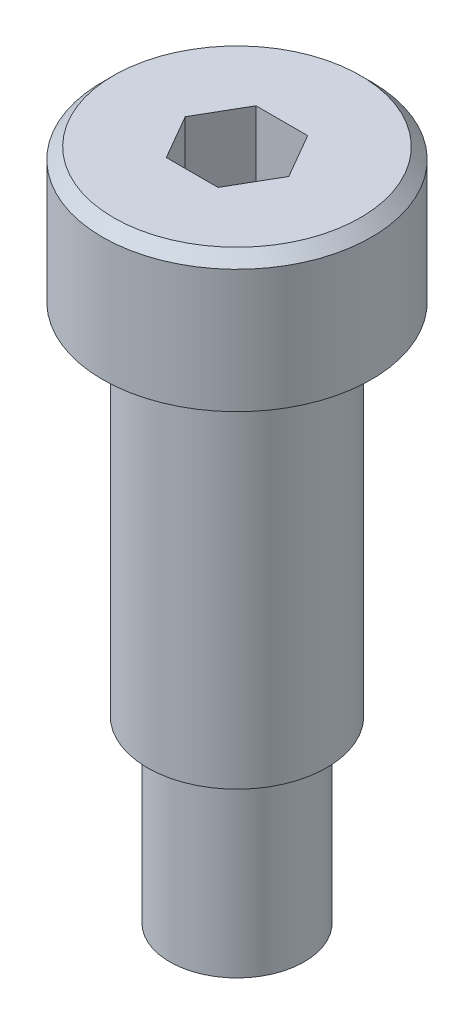
ISO-10303-21;
HEADER;
FILE_DESCRIPTION(('STEP AP214'),'2;1');
FILE_NAME('part.step','',(''),(''),'','','');
FILE_SCHEMA(('AUTOMOTIVE_DESIGN { 1 0 10303 214 1 1 1 1 }'));
ENDSEC;
DATA;
#1=APPLICATION_CONTEXT('core data for automotive mechanical design processes');
#2=APPLICATION_PROTOCOL_DEFINITION('international standard','automotive_design',2000,#1);
#3=PRODUCT_CONTEXT('',#1,'mechanical');
#4=PRODUCT('Part','Part','',(#3));
#5=PRODUCT_RELATED_PRODUCT_CATEGORY('part','',(#4));
#6=PRODUCT_DEFINITION_FORMATION('','',#4);
#7=PRODUCT_DEFINITION_CONTEXT('part definition',#1,'design');
#8=PRODUCT_DEFINITION('design','',#6,#7);
#9=PRODUCT_DEFINITION_SHAPE('','',#8);
#10=(LENGTH_UNIT() NAMED_UNIT(*) SI_UNIT(.MILLI.,.METRE.));
#11=(NAMED_UNIT(*) PLANE_ANGLE_UNIT() SI_UNIT($,.RADIAN.));
#12=(NAMED_UNIT(*) SI_UNIT($,.STERADIAN.) SOLID_ANGLE_UNIT());
#13=UNCERTAINTY_MEASURE_WITH_UNIT(LENGTH_MEASURE(1.E-05),#10,'distance_accuracy_value','');
#14=(GEOMETRIC_REPRESENTATION_CONTEXT(3) GLOBAL_UNCERTAINTY_ASSIGNED_CONTEXT((#13)) GLOBAL_UNIT_ASSIGNED_CONTEXT((#10,
#11,#12)) REPRESENTATION_CONTEXT('',''));
#15=CARTESIAN_POINT('',(0.,0.,0.));
#16=DIRECTION('',(0.,0.,1.));
#17=DIRECTION('',(1.,0.,0.));
#18=AXIS2_PLACEMENT_3D('',#15,#16,#17);
#19=CARTESIAN_POINT('',(0.,3.,0.));
#20=DIRECTION('',(0.,-1.,0.));
#21=DIRECTION('',(0.,0.,-1.));
#22=AXIS2_PLACEMENT_3D('',#19,#20,#21);
#23=CYLINDRICAL_SURFACE('',#22,3.);
#24=CARTESIAN_POINT('',(0.,2.75,0.));
#25=DIRECTION('',(0.,1.,0.));
#26=DIRECTION('',(0.,0.,1.));
#27=AXIS2_PLACEMENT_3D('',#24,#25,#26);
#28=CIRCLE('',#27,3.);
#29=CARTESIAN_POINT('',(0.,2.75,3.));
#30=VERTEX_POINT('',#29);
#31=EDGE_CURVE('E11',#30,#30,#28,.F.);
#32=ORIENTED_EDGE('',*,*,#31,.T.);
#33=EDGE_LOOP('',(#32));
#34=FACE_BOUND('',#33,.T.);
#35=CARTESIAN_POINT('',(0.,0.,0.));
#36=DIRECTION('',(0.,1.,0.));
#37=DIRECTION('',(0.,0.,1.));
#38=AXIS2_PLACEMENT_3D('',#35,#36,#37);
#39=CIRCLE('',#38,3.);
#40=CARTESIAN_POINT('',(0.,0.,3.));
#41=VERTEX_POINT('',#40);
#42=EDGE_CURVE('E153',#41,#41,#39,.T.);
#43=ORIENTED_EDGE('',*,*,#42,.T.);
#44=EDGE_LOOP('',(#43));
#45=FACE_BOUND('',#44,.T.);
#46=ADVANCED_FACE('F37',(#34,#45),#23,.T.);
#47=CARTESIAN_POINT('',(0.,3.,0.));
#48=DIRECTION('',(0.,1.,0.));
#49=DIRECTION('',(0.,0.,1.));
#50=AXIS2_PLACEMENT_3D('',#47,#48,#49);
#51=PLANE('',#50);
#52=CARTESIAN_POINT('',(0.,3.,0.));
#53=DIRECTION('',(0.,1.,0.));
#54=DIRECTION('',(0.,0.,1.));
#55=AXIS2_PLACEMENT_3D('',#52,#53,#54);
#56=CIRCLE('',#55,2.75);
#57=CARTESIAN_POINT('',(0.,3.,2.75));
#58=VERTEX_POINT('',#57);
#59=EDGE_CURVE('E45',#58,#58,#56,.T.);
#60=ORIENTED_EDGE('',*,*,#59,.T.);
#61=EDGE_LOOP('',(#60));
#62=FACE_BOUND('',#61,.T.);
#63=DIRECTION('',(-0.5,0.,-0.866025403784439));
#64=VECTOR('',#63,1.);
#65=CARTESIAN_POINT('',(1.15470053837925,3.,0.));
#66=LINE('',#65,#64);
#67=CARTESIAN_POINT('',(1.15470053837925,3.,0.));
#68=VERTEX_POINT('',#67);
#69=CARTESIAN_POINT('',(0.577350269189626,3.,-1.));
#70=VERTEX_POINT('',#69);
#71=EDGE_CURVE('E52',#68,#70,#66,.T.);
#72=ORIENTED_EDGE('',*,*,#71,.F.);
#73=DIRECTION('',(0.5,0.,-0.866025403784439));
#74=VECTOR('',#73,1.);
#75=CARTESIAN_POINT('',(0.577350269189626,3.,1.));
#76=LINE('',#75,#74);
#77=CARTESIAN_POINT('',(0.577350269189626,3.,1.));
#78=VERTEX_POINT('',#77);
#79=EDGE_CURVE('E135',#78,#68,#76,.T.);
#80=ORIENTED_EDGE('',*,*,#79,.F.);
#81=DIRECTION('',(1.,0.,0.));
#82=VECTOR('',#81,1.);
#83=CARTESIAN_POINT('',(-0.577350269189625,3.,1.));
#84=LINE('',#83,#82);
#85=CARTESIAN_POINT('',(-0.577350269189625,3.,1.));
#86=VERTEX_POINT('',#85);
#87=EDGE_CURVE('E133',#86,#78,#84,.T.);
#88=ORIENTED_EDGE('',*,*,#87,.F.);
#89=DIRECTION('',(0.5,0.,0.866025403784439));
#90=VECTOR('',#89,1.);
#91=CARTESIAN_POINT('',(-1.15470053837925,3.,0.));
#92=LINE('',#91,#90);
#93=CARTESIAN_POINT('',(-1.15470053837925,3.,0.));
#94=VERTEX_POINT('',#93);
#95=EDGE_CURVE('E100',#94,#86,#92,.T.);
#96=ORIENTED_EDGE('',*,*,#95,.F.);
#97=DIRECTION('',(-0.5,0.,0.866025403784439));
#98=VECTOR('',#97,1.);
#99=CARTESIAN_POINT('',(-0.577350269189626,3.,-1.));
#100=LINE('',#99,#98);
#101=CARTESIAN_POINT('',(-0.577350269189626,3.,-1.));
#102=VERTEX_POINT('',#101);
#103=EDGE_CURVE('E129',#102,#94,#100,.T.);
#104=ORIENTED_EDGE('',*,*,#103,.F.);
#105=DIRECTION('',(-1.,0.,0.));
#106=VECTOR('',#105,1.);
#107=CARTESIAN_POINT('',(0.577350269189626,3.,-1.));
#108=LINE('',#107,#106);
#109=EDGE_CURVE('E126',#70,#102,#108,.T.);
#110=ORIENTED_EDGE('',*,*,#109,.F.);
#111=EDGE_LOOP('',(#72,#80,#88,#96,#104,#110));
#112=FACE_BOUND('',#111,.T.);
#113=ADVANCED_FACE('F161',(#62,#112),#51,.T.);
#114=CARTESIAN_POINT('',(0.,0.,0.));
#115=DIRECTION('',(0.,1.,0.));
#116=DIRECTION('',(0.,0.,1.));
#117=AXIS2_PLACEMENT_3D('',#114,#115,#116);
#118=PLANE('',#117);
#119=CARTESIAN_POINT('',(0.,0.,0.));
#120=DIRECTION('',(0.,1.,0.));
#121=DIRECTION('',(0.,0.,1.));
#122=AXIS2_PLACEMENT_3D('',#119,#120,#121);
#123=CIRCLE('',#122,2.);
#124=CARTESIAN_POINT('',(0.,0.,2.));
#125=VERTEX_POINT('',#124);
#126=EDGE_CURVE('E156',#125,#125,#123,.F.);
#127=ORIENTED_EDGE('',*,*,#126,.F.);
#128=EDGE_LOOP('',(#127));
#129=FACE_BOUND('',#128,.T.);
#130=ORIENTED_EDGE('',*,*,#42,.F.);
#131=EDGE_LOOP('',(#130));
#132=FACE_BOUND('',#131,.T.);
#133=ADVANCED_FACE('F177',(#129,#132),#118,.F.);
#134=CARTESIAN_POINT('',(0.,-8.,0.));
#135=DIRECTION('',(0.,1.,0.));
#136=DIRECTION('',(0.,0.,1.));
#137=AXIS2_PLACEMENT_3D('',#134,#135,#136);
#138=CYLINDRICAL_SURFACE('',#137,2.);
#139=CARTESIAN_POINT('',(0.,-8.,0.));
#140=DIRECTION('',(0.,-1.,0.));
#141=DIRECTION('',(0.,0.,-1.));
#142=AXIS2_PLACEMENT_3D('',#139,#140,#141);
#143=CIRCLE('',#142,2.);
#144=CARTESIAN_POINT('',(0.,-8.,-2.));
#145=VERTEX_POINT('',#144);
#146=EDGE_CURVE('E148',#145,#145,#143,.T.);
#147=ORIENTED_EDGE('',*,*,#146,.F.);
#148=EDGE_LOOP('',(#147));
#149=FACE_BOUND('',#148,.T.);
#150=ORIENTED_EDGE('',*,*,#126,.T.);
#151=EDGE_LOOP('',(#150));
#152=FACE_BOUND('',#151,.T.);
#153=ADVANCED_FACE('F182',(#149,#152),#138,.T.);
#154=CARTESIAN_POINT('',(0.,-8.,0.));
#155=DIRECTION('',(0.,-1.,0.));
#156=DIRECTION('',(0.,0.,-1.));
#157=AXIS2_PLACEMENT_3D('',#154,#155,#156);
#158=PLANE('',#157);
#159=CARTESIAN_POINT('',(0.,-8.,0.));
#160=DIRECTION('',(0.,-1.,0.));
#161=DIRECTION('',(0.,0.,-1.));
#162=AXIS2_PLACEMENT_3D('',#159,#160,#161);
#163=CIRCLE('',#162,1.5);
#164=CARTESIAN_POINT('',(0.,-8.,-1.5));
#165=VERTEX_POINT('',#164);
#166=EDGE_CURVE('E139',#165,#165,#163,.T.);
#167=ORIENTED_EDGE('',*,*,#166,.F.);
#168=EDGE_LOOP('',(#167));
#169=FACE_BOUND('',#168,.T.);
#170=ORIENTED_EDGE('',*,*,#146,.T.);
#171=EDGE_LOOP('',(#170));
#172=FACE_BOUND('',#171,.T.);
#173=ADVANCED_FACE('F187',(#169,#172),#158,.T.);
#174=CARTESIAN_POINT('',(0.,-12.,0.));
#175=DIRECTION('',(0.,1.,0.));
#176=DIRECTION('',(0.,0.,1.));
#177=AXIS2_PLACEMENT_3D('',#174,#175,#176);
#178=CYLINDRICAL_SURFACE('',#177,1.5);
#179=CARTESIAN_POINT('',(0.,-12.,0.));
#180=DIRECTION('',(0.,-1.,0.));
#181=DIRECTION('',(0.,0.,-1.));
#182=AXIS2_PLACEMENT_3D('',#179,#180,#181);
#183=CIRCLE('',#182,1.5);
#184=CARTESIAN_POINT('',(0.,-12.,-1.5));
#185=VERTEX_POINT('',#184);
#186=EDGE_CURVE('E145',#185,#185,#183,.T.);
#187=ORIENTED_EDGE('',*,*,#186,.F.);
#188=EDGE_LOOP('',(#187));
#189=FACE_BOUND('',#188,.T.);
#190=ORIENTED_EDGE('',*,*,#166,.T.);
#191=EDGE_LOOP('',(#190));
#192=FACE_BOUND('',#191,.T.);
#193=ADVANCED_FACE('F191',(#189,#192),#178,.T.);
#194=CARTESIAN_POINT('',(0.,-12.,0.));
#195=DIRECTION('',(0.,-1.,0.));
#196=DIRECTION('',(0.,0.,-1.));
#197=AXIS2_PLACEMENT_3D('',#194,#195,#196);
#198=PLANE('',#197);
#199=ORIENTED_EDGE('',*,*,#186,.T.);
#200=EDGE_LOOP('',(#199));
#201=FACE_BOUND('',#200,.T.);
#202=ADVANCED_FACE('F195',(#201),#198,.T.);
#203=CARTESIAN_POINT('',(1.15470053837925,1.,0.));
#204=DIRECTION('',(0.866025403784439,0.,-0.5));
#205=DIRECTION('',(-0.5,0.,-0.866025403784439));
#206=AXIS2_PLACEMENT_3D('',#203,#204,#205);
#207=PLANE('',#206);
#208=ORIENTED_EDGE('',*,*,#71,.T.);
#209=DIRECTION('',(0.,1.,0.));
#210=VECTOR('',#209,1.);
#211=CARTESIAN_POINT('',(0.577350269189626,1.,-1.));
#212=LINE('',#211,#210);
#213=CARTESIAN_POINT('',(0.577350269189626,1.,-1.));
#214=VERTEX_POINT('',#213);
#215=EDGE_CURVE('E82',#214,#70,#212,.T.);
#216=ORIENTED_EDGE('',*,*,#215,.F.);
#217=DIRECTION('',(-0.5,0.,-0.866025403784439));
#218=VECTOR('',#217,1.);
#219=CARTESIAN_POINT('',(1.15470053837925,1.,0.));
#220=LINE('',#219,#218);
#221=CARTESIAN_POINT('',(1.15470053837925,1.,0.));
#222=VERTEX_POINT('',#221);
#223=EDGE_CURVE('E137',#222,#214,#220,.T.);
#224=ORIENTED_EDGE('',*,*,#223,.F.);
#225=DIRECTION('',(0.,1.,0.));
#226=VECTOR('',#225,1.);
#227=CARTESIAN_POINT('',(1.15470053837925,1.,0.));
#228=LINE('',#227,#226);
#229=EDGE_CURVE('E60',#222,#68,#228,.T.);
#230=ORIENTED_EDGE('',*,*,#229,.T.);
#231=EDGE_LOOP('',(#208,#216,#224,#230));
#232=FACE_BOUND('',#231,.T.);
#233=ADVANCED_FACE('F199',(#232),#207,.F.);
#234=CARTESIAN_POINT('',(0.577350269189626,1.,1.));
#235=DIRECTION('',(0.866025403784439,0.,0.5));
#236=DIRECTION('',(0.5,0.,-0.866025403784439));
#237=AXIS2_PLACEMENT_3D('',#234,#235,#236);
#238=PLANE('',#237);
#239=ORIENTED_EDGE('',*,*,#79,.T.);
#240=ORIENTED_EDGE('',*,*,#229,.F.);
#241=DIRECTION('',(0.5,0.,-0.866025403784439));
#242=VECTOR('',#241,1.);
#243=CARTESIAN_POINT('',(0.577350269189626,1.,1.));
#244=LINE('',#243,#242);
#245=CARTESIAN_POINT('',(0.577350269189626,1.,1.));
#246=VERTEX_POINT('',#245);
#247=EDGE_CURVE('E112',#246,#222,#244,.T.);
#248=ORIENTED_EDGE('',*,*,#247,.F.);
#249=DIRECTION('',(0.,1.,0.));
#250=VECTOR('',#249,1.);
#251=CARTESIAN_POINT('',(0.577350269189626,1.,1.));
#252=LINE('',#251,#250);
#253=EDGE_CURVE('E104',#246,#78,#252,.T.);
#254=ORIENTED_EDGE('',*,*,#253,.T.);
#255=EDGE_LOOP('',(#239,#240,#248,#254));
#256=FACE_BOUND('',#255,.T.);
#257=ADVANCED_FACE('F203',(#256),#238,.F.);
#258=CARTESIAN_POINT('',(-0.577350269189625,1.,1.));
#259=DIRECTION('',(0.,0.,1.));
#260=DIRECTION('',(1.,0.,0.));
#261=AXIS2_PLACEMENT_3D('',#258,#259,#260);
#262=PLANE('',#261);
#263=ORIENTED_EDGE('',*,*,#87,.T.);
#264=ORIENTED_EDGE('',*,*,#253,.F.);
#265=DIRECTION('',(1.,0.,0.));
#266=VECTOR('',#265,1.);
#267=CARTESIAN_POINT('',(-0.577350269189625,1.,1.));
#268=LINE('',#267,#266);
#269=CARTESIAN_POINT('',(-0.577350269189625,1.,1.));
#270=VERTEX_POINT('',#269);
#271=EDGE_CURVE('E108',#270,#246,#268,.T.);
#272=ORIENTED_EDGE('',*,*,#271,.F.);
#273=DIRECTION('',(0.,1.,0.));
#274=VECTOR('',#273,1.);
#275=CARTESIAN_POINT('',(-0.577350269189625,1.,1.));
#276=LINE('',#275,#274);
#277=EDGE_CURVE('E93',#270,#86,#276,.T.);
#278=ORIENTED_EDGE('',*,*,#277,.T.);
#279=EDGE_LOOP('',(#263,#264,#272,#278));
#280=FACE_BOUND('',#279,.T.);
#281=ADVANCED_FACE('F109',(#280),#262,.F.);
#282=CARTESIAN_POINT('',(-1.15470053837925,1.,0.));
#283=DIRECTION('',(-0.866025403784439,0.,0.5));
#284=DIRECTION('',(0.5,0.,0.866025403784439));
#285=AXIS2_PLACEMENT_3D('',#282,#283,#284);
#286=PLANE('',#285);
#287=ORIENTED_EDGE('',*,*,#95,.T.);
#288=ORIENTED_EDGE('',*,*,#277,.F.);
#289=DIRECTION('',(0.5,0.,0.866025403784439));
#290=VECTOR('',#289,1.);
#291=CARTESIAN_POINT('',(-1.15470053837925,1.,0.));
#292=LINE('',#291,#290);
#293=CARTESIAN_POINT('',(-1.15470053837925,1.,0.));
#294=VERTEX_POINT('',#293);
#295=EDGE_CURVE('E97',#294,#270,#292,.T.);
#296=ORIENTED_EDGE('',*,*,#295,.F.);
#297=DIRECTION('',(0.,1.,0.));
#298=VECTOR('',#297,1.);
#299=CARTESIAN_POINT('',(-1.15470053837925,1.,0.));
#300=LINE('',#299,#298);
#301=EDGE_CURVE('E105',#294,#94,#300,.T.);
#302=ORIENTED_EDGE('',*,*,#301,.T.);
#303=EDGE_LOOP('',(#287,#288,#296,#302));
#304=FACE_BOUND('',#303,.T.);
#305=ADVANCED_FACE('F95',(#304),#286,.F.);
#306=CARTESIAN_POINT('',(-0.577350269189626,1.,-1.));
#307=DIRECTION('',(-0.866025403784439,0.,-0.5));
#308=DIRECTION('',(-0.5,0.,0.866025403784439));
#309=AXIS2_PLACEMENT_3D('',#306,#307,#308);
#310=PLANE('',#309);
#311=ORIENTED_EDGE('',*,*,#103,.T.);
#312=ORIENTED_EDGE('',*,*,#301,.F.);
#313=DIRECTION('',(-0.5,0.,0.866025403784439));
#314=VECTOR('',#313,1.);
#315=CARTESIAN_POINT('',(-0.577350269189626,1.,-1.));
#316=LINE('',#315,#314);
#317=CARTESIAN_POINT('',(-0.577350269189626,1.,-1.));
#318=VERTEX_POINT('',#317);
#319=EDGE_CURVE('E118',#318,#294,#316,.T.);
#320=ORIENTED_EDGE('',*,*,#319,.F.);
#321=DIRECTION('',(0.,1.,0.));
#322=VECTOR('',#321,1.);
#323=CARTESIAN_POINT('',(-0.577350269189626,1.,-1.));
#324=LINE('',#323,#322);
#325=EDGE_CURVE('E142',#318,#102,#324,.T.);
#326=ORIENTED_EDGE('',*,*,#325,.T.);
#327=EDGE_LOOP('',(#311,#312,#320,#326));
#328=FACE_BOUND('',#327,.T.);
#329=ADVANCED_FACE('F206',(#328),#310,.F.);
#330=CARTESIAN_POINT('',(0.577350269189626,1.,-1.));
#331=DIRECTION('',(0.,0.,-1.));
#332=DIRECTION('',(-1.,0.,0.));
#333=AXIS2_PLACEMENT_3D('',#330,#331,#332);
#334=PLANE('',#333);
#335=ORIENTED_EDGE('',*,*,#109,.T.);
#336=ORIENTED_EDGE('',*,*,#325,.F.);
#337=DIRECTION('',(-1.,0.,0.));
#338=VECTOR('',#337,1.);
#339=CARTESIAN_POINT('',(0.577350269189626,1.,-1.));
#340=LINE('',#339,#338);
#341=EDGE_CURVE('E120',#214,#318,#340,.T.);
#342=ORIENTED_EDGE('',*,*,#341,.F.);
#343=ORIENTED_EDGE('',*,*,#215,.T.);
#344=EDGE_LOOP('',(#335,#336,#342,#343));
#345=FACE_BOUND('',#344,.T.);
#346=ADVANCED_FACE('F169',(#345),#334,.F.);
#347=CARTESIAN_POINT('',(0.,1.,0.));
#348=DIRECTION('',(0.,1.,0.));
#349=DIRECTION('',(0.,0.,1.));
#350=AXIS2_PLACEMENT_3D('',#347,#348,#349);
#351=PLANE('',#350);
#352=ORIENTED_EDGE('',*,*,#223,.T.);
#353=ORIENTED_EDGE('',*,*,#341,.T.);
#354=ORIENTED_EDGE('',*,*,#319,.T.);
#355=ORIENTED_EDGE('',*,*,#295,.T.);
#356=ORIENTED_EDGE('',*,*,#271,.T.);
#357=ORIENTED_EDGE('',*,*,#247,.T.);
#358=EDGE_LOOP('',(#352,#353,#354,#355,#356,#357));
#359=FACE_BOUND('',#358,.T.);
#360=ADVANCED_FACE('F115',(#359),#351,.T.);
#361=CARTESIAN_POINT('',(0.,3.,0.));
#362=DIRECTION('',(0.,-1.,0.));
#363=DIRECTION('',(0.,0.,-1.));
#364=AXIS2_PLACEMENT_3D('',#361,#362,#363);
#365=CONICAL_SURFACE('',#364,2.75,0.785398163397444);
#366=ORIENTED_EDGE('',*,*,#31,.F.);
#367=EDGE_LOOP('',(#366));
#368=FACE_BOUND('',#367,.T.);
#369=ORIENTED_EDGE('',*,*,#59,.F.);
#370=EDGE_LOOP('',(#369));
#371=FACE_BOUND('',#370,.T.);
#372=ADVANCED_FACE('F39',(#368,#371),#365,.T.);
#373=CLOSED_SHELL('',(#46,#113,#133,#153,#173,#193,#202,#233,#257,#281,#305,#329,#346,#360,#372));
#374=MANIFOLD_SOLID_BREP('B2',#373);
#375=ADVANCED_BREP_SHAPE_REPRESENTATION('',(#18,#374),#14);
#376=SHAPE_DEFINITION_REPRESENTATION(#9,#375);
ENDSEC;
END-ISO-10303-21;
